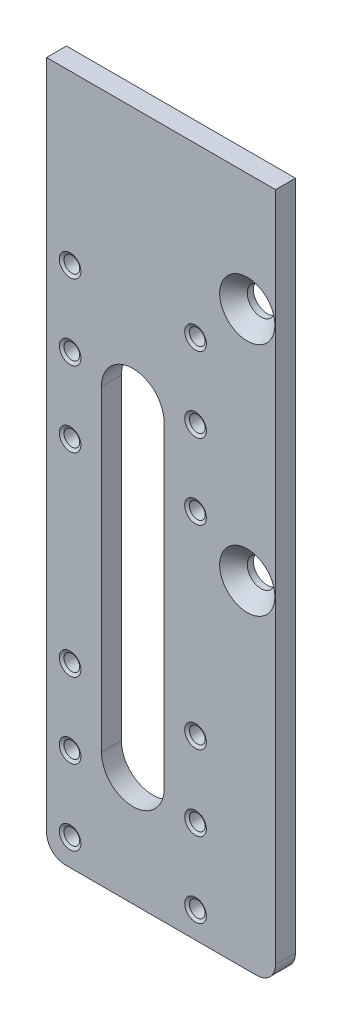
ISO-10303-21;
HEADER;
FILE_DESCRIPTION(('STEP AP214'),'2;1');
FILE_NAME('part.step','',(''),(''),'','','');
FILE_SCHEMA(('AUTOMOTIVE_DESIGN { 1 0 10303 214 1 1 1 1 }'));
ENDSEC;
DATA;
#1=APPLICATION_CONTEXT('core data for automotive mechanical design processes');
#2=APPLICATION_PROTOCOL_DEFINITION('international standard','automotive_design',2000,#1);
#3=PRODUCT_CONTEXT('',#1,'mechanical');
#4=PRODUCT('Part','Part','',(#3));
#5=PRODUCT_RELATED_PRODUCT_CATEGORY('part','',(#4));
#6=PRODUCT_DEFINITION_FORMATION('','',#4);
#7=PRODUCT_DEFINITION_CONTEXT('part definition',#1,'design');
#8=PRODUCT_DEFINITION('design','',#6,#7);
#9=PRODUCT_DEFINITION_SHAPE('','',#8);
#10=(LENGTH_UNIT() NAMED_UNIT(*) SI_UNIT(.MILLI.,.METRE.));
#11=(NAMED_UNIT(*) PLANE_ANGLE_UNIT() SI_UNIT($,.RADIAN.));
#12=(NAMED_UNIT(*) SI_UNIT($,.STERADIAN.) SOLID_ANGLE_UNIT());
#13=UNCERTAINTY_MEASURE_WITH_UNIT(LENGTH_MEASURE(1.E-05),#10,'distance_accuracy_value','');
#14=(GEOMETRIC_REPRESENTATION_CONTEXT(3) GLOBAL_UNCERTAINTY_ASSIGNED_CONTEXT((#13)) GLOBAL_UNIT_ASSIGNED_CONTEXT((#10,
#11,#12)) REPRESENTATION_CONTEXT('',''));
#15=CARTESIAN_POINT('',(0.,0.,0.));
#16=DIRECTION('',(0.,0.,1.));
#17=DIRECTION('',(1.,0.,0.));
#18=AXIS2_PLACEMENT_3D('',#15,#16,#17);
#19=CARTESIAN_POINT('',(-525.816847611489,-465.810072168843,246.750729330188));
#20=DIRECTION('',(0.,0.,1.));
#21=DIRECTION('',(0.,-1.,0.));
#22=AXIS2_PLACEMENT_3D('',#19,#20,#21);
#23=CONICAL_SURFACE('',#22,3.44999999994955,1.04719755119663);
#24=CARTESIAN_POINT('',(-525.816847611489,-465.810072168843,246.750729330242));
#25=DIRECTION('',(0.,0.,1.));
#26=DIRECTION('',(0.,-1.,0.));
#27=AXIS2_PLACEMENT_3D('',#24,#25,#26);
#28=CIRCLE('',#27,3.45000000004347);
#29=CARTESIAN_POINT('',(-525.816847611489,-469.260072168886,246.750729330242));
#30=VERTEX_POINT('',#29);
#31=EDGE_CURVE('E269',#30,#30,#28,.T.);
#32=ORIENTED_EDGE('',*,*,#31,.T.);
#33=EDGE_LOOP('',(#32));
#34=FACE_BOUND('',#33,.T.);
#35=CARTESIAN_POINT('',(-525.816847611489,-465.810072168843,246.202246574448));
#36=DIRECTION('',(0.,0.,1.));
#37=DIRECTION('',(0.,-1.,0.));
#38=AXIS2_PLACEMENT_3D('',#35,#36,#37);
#39=CIRCLE('',#38,2.5);
#40=CARTESIAN_POINT('',(-525.816847611489,-468.310072168843,246.202246574448));
#41=VERTEX_POINT('',#40);
#42=EDGE_CURVE('E178',#41,#41,#39,.F.);
#43=ORIENTED_EDGE('',*,*,#42,.T.);
#44=EDGE_LOOP('',(#43));
#45=FACE_BOUND('',#44,.T.);
#46=ADVANCED_FACE('F17',(#34,#45),#23,.F.);
#47=CARTESIAN_POINT('',(-525.816847611489,-489.810072168843,246.750729330188));
#48=DIRECTION('',(0.,0.,1.));
#49=DIRECTION('',(0.,-1.,0.));
#50=AXIS2_PLACEMENT_3D('',#47,#48,#49);
#51=CONICAL_SURFACE('',#50,3.44999999994955,1.04719755119663);
#52=CARTESIAN_POINT('',(-525.816847611489,-489.810072168843,246.750729330242));
#53=DIRECTION('',(0.,0.,1.));
#54=DIRECTION('',(0.,-1.,0.));
#55=AXIS2_PLACEMENT_3D('',#52,#53,#54);
#56=CIRCLE('',#55,3.45000000004347);
#57=CARTESIAN_POINT('',(-525.816847611489,-493.260072168886,246.750729330242));
#58=VERTEX_POINT('',#57);
#59=EDGE_CURVE('E275',#58,#58,#56,.T.);
#60=ORIENTED_EDGE('',*,*,#59,.T.);
#61=EDGE_LOOP('',(#60));
#62=FACE_BOUND('',#61,.T.);
#63=CARTESIAN_POINT('',(-525.816847611489,-489.810072168843,246.202246574448));
#64=DIRECTION('',(0.,0.,1.));
#65=DIRECTION('',(0.,-1.,0.));
#66=AXIS2_PLACEMENT_3D('',#63,#64,#65);
#67=CIRCLE('',#66,2.5);
#68=CARTESIAN_POINT('',(-525.816847611489,-492.310072168843,246.202246574448));
#69=VERTEX_POINT('',#68);
#70=EDGE_CURVE('E175',#69,#69,#67,.F.);
#71=ORIENTED_EDGE('',*,*,#70,.T.);
#72=EDGE_LOOP('',(#71));
#73=FACE_BOUND('',#72,.T.);
#74=ADVANCED_FACE('F681',(#62,#73),#51,.F.);
#75=CARTESIAN_POINT('',(-525.816847611489,-355.810072168843,246.750729330188));
#76=DIRECTION('',(0.,0.,1.));
#77=DIRECTION('',(0.,-1.,0.));
#78=AXIS2_PLACEMENT_3D('',#75,#76,#77);
#79=CONICAL_SURFACE('',#78,3.44999999994955,1.04719755119663);
#80=CARTESIAN_POINT('',(-525.816847611489,-355.810072168843,246.750729330242));
#81=DIRECTION('',(0.,0.,1.));
#82=DIRECTION('',(0.,-1.,0.));
#83=AXIS2_PLACEMENT_3D('',#80,#81,#82);
#84=CIRCLE('',#83,3.45000000004347);
#85=CARTESIAN_POINT('',(-525.816847611489,-359.260072168886,246.750729330242));
#86=VERTEX_POINT('',#85);
#87=EDGE_CURVE('E98',#86,#86,#84,.T.);
#88=ORIENTED_EDGE('',*,*,#87,.T.);
#89=EDGE_LOOP('',(#88));
#90=FACE_BOUND('',#89,.T.);
#91=CARTESIAN_POINT('',(-525.816847611489,-355.810072168843,246.202246574448));
#92=DIRECTION('',(0.,0.,1.));
#93=DIRECTION('',(0.,-1.,0.));
#94=AXIS2_PLACEMENT_3D('',#91,#92,#93);
#95=CIRCLE('',#94,2.5);
#96=CARTESIAN_POINT('',(-525.816847611489,-358.310072168843,246.202246574448));
#97=VERTEX_POINT('',#96);
#98=EDGE_CURVE('E172',#97,#97,#95,.F.);
#99=ORIENTED_EDGE('',*,*,#98,.T.);
#100=EDGE_LOOP('',(#99));
#101=FACE_BOUND('',#100,.T.);
#102=ADVANCED_FACE('F672',(#90,#101),#79,.F.);
#103=CARTESIAN_POINT('',(-525.816847611489,-379.810072168843,246.750729330188));
#104=DIRECTION('',(0.,0.,1.));
#105=DIRECTION('',(0.,-1.,0.));
#106=AXIS2_PLACEMENT_3D('',#103,#104,#105);
#107=CONICAL_SURFACE('',#106,3.44999999994955,1.04719755119663);
#108=CARTESIAN_POINT('',(-525.816847611489,-379.810072168843,246.750729330242));
#109=DIRECTION('',(0.,0.,1.));
#110=DIRECTION('',(0.,-1.,0.));
#111=AXIS2_PLACEMENT_3D('',#108,#109,#110);
#112=CIRCLE('',#111,3.45000000004347);
#113=CARTESIAN_POINT('',(-525.816847611489,-383.260072168886,246.750729330242));
#114=VERTEX_POINT('',#113);
#115=EDGE_CURVE('E254',#114,#114,#112,.T.);
#116=ORIENTED_EDGE('',*,*,#115,.T.);
#117=EDGE_LOOP('',(#116));
#118=FACE_BOUND('',#117,.T.);
#119=CARTESIAN_POINT('',(-525.816847611489,-379.810072168843,246.202246574448));
#120=DIRECTION('',(0.,0.,1.));
#121=DIRECTION('',(0.,-1.,0.));
#122=AXIS2_PLACEMENT_3D('',#119,#120,#121);
#123=CIRCLE('',#122,2.5);
#124=CARTESIAN_POINT('',(-525.816847611489,-382.310072168843,246.202246574448));
#125=VERTEX_POINT('',#124);
#126=EDGE_CURVE('E169',#125,#125,#123,.F.);
#127=ORIENTED_EDGE('',*,*,#126,.T.);
#128=EDGE_LOOP('',(#127));
#129=FACE_BOUND('',#128,.T.);
#130=ADVANCED_FACE('F663',(#118,#129),#107,.F.);
#131=CARTESIAN_POINT('',(-525.816847611489,-403.810072168843,246.750729330188));
#132=DIRECTION('',(0.,0.,1.));
#133=DIRECTION('',(0.,-1.,0.));
#134=AXIS2_PLACEMENT_3D('',#131,#132,#133);
#135=CONICAL_SURFACE('',#134,3.44999999994955,1.04719755119663);
#136=CARTESIAN_POINT('',(-525.816847611489,-403.810072168843,246.750729330242));
#137=DIRECTION('',(0.,0.,1.));
#138=DIRECTION('',(0.,-1.,0.));
#139=AXIS2_PLACEMENT_3D('',#136,#137,#138);
#140=CIRCLE('',#139,3.45000000004347);
#141=CARTESIAN_POINT('',(-525.816847611489,-407.260072168886,246.750729330242));
#142=VERTEX_POINT('',#141);
#143=EDGE_CURVE('E266',#142,#142,#140,.T.);
#144=ORIENTED_EDGE('',*,*,#143,.T.);
#145=EDGE_LOOP('',(#144));
#146=FACE_BOUND('',#145,.T.);
#147=CARTESIAN_POINT('',(-525.816847611489,-403.810072168843,246.202246574448));
#148=DIRECTION('',(0.,0.,1.));
#149=DIRECTION('',(0.,-1.,0.));
#150=AXIS2_PLACEMENT_3D('',#147,#148,#149);
#151=CIRCLE('',#150,2.5);
#152=CARTESIAN_POINT('',(-525.816847611489,-406.310072168843,246.202246574448));
#153=VERTEX_POINT('',#152);
#154=EDGE_CURVE('E166',#153,#153,#151,.F.);
#155=ORIENTED_EDGE('',*,*,#154,.T.);
#156=EDGE_LOOP('',(#155));
#157=FACE_BOUND('',#156,.T.);
#158=ADVANCED_FACE('F655',(#146,#157),#135,.F.);
#159=CARTESIAN_POINT('',(-565.816847611489,-355.810072168843,246.750729330131));
#160=DIRECTION('',(0.,0.,1.));
#161=DIRECTION('',(1.,0.,0.));
#162=AXIS2_PLACEMENT_3D('',#159,#160,#161);
#163=CONICAL_SURFACE('',#162,3.44999999985629,1.04719755119663);
#164=CARTESIAN_POINT('',(-565.816847611489,-355.810072168843,246.750729330173));
#165=DIRECTION('',(0.,0.,1.));
#166=DIRECTION('',(1.,0.,0.));
#167=AXIS2_PLACEMENT_3D('',#164,#165,#166);
#168=CIRCLE('',#167,3.44999999992979);
#169=CARTESIAN_POINT('',(-562.366847611559,-355.810072168843,246.750729330173));
#170=VERTEX_POINT('',#169);
#171=EDGE_CURVE('E277',#170,#170,#168,.T.);
#172=ORIENTED_EDGE('',*,*,#171,.T.);
#173=EDGE_LOOP('',(#172));
#174=FACE_BOUND('',#173,.T.);
#175=CARTESIAN_POINT('',(-565.816847611489,-355.810072168843,246.202246574448));
#176=DIRECTION('',(0.,0.,1.));
#177=DIRECTION('',(0.,-1.,0.));
#178=AXIS2_PLACEMENT_3D('',#175,#176,#177);
#179=CIRCLE('',#178,2.5);
#180=CARTESIAN_POINT('',(-565.816847611489,-358.310072168843,246.202246574448));
#181=VERTEX_POINT('',#180);
#182=EDGE_CURVE('E163',#181,#181,#179,.F.);
#183=ORIENTED_EDGE('',*,*,#182,.T.);
#184=EDGE_LOOP('',(#183));
#185=FACE_BOUND('',#184,.T.);
#186=ADVANCED_FACE('F646',(#174,#185),#163,.F.);
#187=CARTESIAN_POINT('',(-565.816847611489,-379.810072168843,246.750729330131));
#188=DIRECTION('',(0.,0.,1.));
#189=DIRECTION('',(1.,0.,0.));
#190=AXIS2_PLACEMENT_3D('',#187,#188,#189);
#191=CONICAL_SURFACE('',#190,3.44999999985629,1.04719755119663);
#192=CARTESIAN_POINT('',(-565.816847611489,-379.810072168843,246.750729330173));
#193=DIRECTION('',(0.,0.,1.));
#194=DIRECTION('',(1.,0.,0.));
#195=AXIS2_PLACEMENT_3D('',#192,#193,#194);
#196=CIRCLE('',#195,3.44999999992979);
#197=CARTESIAN_POINT('',(-562.366847611559,-379.810072168843,246.750729330173));
#198=VERTEX_POINT('',#197);
#199=EDGE_CURVE('E260',#198,#198,#196,.T.);
#200=ORIENTED_EDGE('',*,*,#199,.T.);
#201=EDGE_LOOP('',(#200));
#202=FACE_BOUND('',#201,.T.);
#203=CARTESIAN_POINT('',(-565.816847611489,-379.810072168843,246.202246574448));
#204=DIRECTION('',(0.,0.,1.));
#205=DIRECTION('',(0.,-1.,0.));
#206=AXIS2_PLACEMENT_3D('',#203,#204,#205);
#207=CIRCLE('',#206,2.5);
#208=CARTESIAN_POINT('',(-565.816847611489,-382.310072168843,246.202246574448));
#209=VERTEX_POINT('',#208);
#210=EDGE_CURVE('E160',#209,#209,#207,.F.);
#211=ORIENTED_EDGE('',*,*,#210,.T.);
#212=EDGE_LOOP('',(#211));
#213=FACE_BOUND('',#212,.T.);
#214=ADVANCED_FACE('F637',(#202,#213),#191,.F.);
#215=CARTESIAN_POINT('',(-565.816847611489,-403.810072168843,246.750729330131));
#216=DIRECTION('',(0.,0.,1.));
#217=DIRECTION('',(1.,0.,0.));
#218=AXIS2_PLACEMENT_3D('',#215,#216,#217);
#219=CONICAL_SURFACE('',#218,3.44999999985629,1.04719755119663);
#220=CARTESIAN_POINT('',(-565.816847611489,-403.810072168843,246.750729330173));
#221=DIRECTION('',(0.,0.,1.));
#222=DIRECTION('',(1.,0.,0.));
#223=AXIS2_PLACEMENT_3D('',#220,#221,#222);
#224=CIRCLE('',#223,3.44999999992979);
#225=CARTESIAN_POINT('',(-562.366847611559,-403.810072168843,246.750729330173));
#226=VERTEX_POINT('',#225);
#227=EDGE_CURVE('E272',#226,#226,#224,.T.);
#228=ORIENTED_EDGE('',*,*,#227,.T.);
#229=EDGE_LOOP('',(#228));
#230=FACE_BOUND('',#229,.T.);
#231=CARTESIAN_POINT('',(-565.816847611489,-403.810072168843,246.202246574448));
#232=DIRECTION('',(0.,0.,1.));
#233=DIRECTION('',(0.,-1.,0.));
#234=AXIS2_PLACEMENT_3D('',#231,#232,#233);
#235=CIRCLE('',#234,2.5);
#236=CARTESIAN_POINT('',(-565.816847611489,-406.310072168843,246.202246574448));
#237=VERTEX_POINT('',#236);
#238=EDGE_CURVE('E157',#237,#237,#235,.F.);
#239=ORIENTED_EDGE('',*,*,#238,.T.);
#240=EDGE_LOOP('',(#239));
#241=FACE_BOUND('',#240,.T.);
#242=ADVANCED_FACE('F628',(#230,#241),#219,.F.);
#243=CARTESIAN_POINT('',(-509.316847611489,-414.701572168842,246.750729330131));
#244=DIRECTION('',(0.,0.,1.));
#245=DIRECTION('',(1.,0.,0.));
#246=AXIS2_PLACEMENT_3D('',#243,#244,#245);
#247=CONICAL_SURFACE('',#246,8.79999999990633,0.785398163397448);
#248=CARTESIAN_POINT('',(-509.316847611489,-414.701572168842,246.750729330188));
#249=DIRECTION('',(0.,0.,1.));
#250=DIRECTION('',(1.,0.,0.));
#251=AXIS2_PLACEMENT_3D('',#248,#249,#250);
#252=CIRCLE('',#251,8.79999999996317);
#253=CARTESIAN_POINT('',(-500.516847611526,-414.701572168842,246.750729330188));
#254=VERTEX_POINT('',#253);
#255=EDGE_CURVE('E245',#254,#254,#252,.T.);
#256=ORIENTED_EDGE('',*,*,#255,.T.);
#257=EDGE_LOOP('',(#256));
#258=FACE_BOUND('',#257,.T.);
#259=CARTESIAN_POINT('',(-509.316847611489,-414.701572168842,242.350729330178));
#260=DIRECTION('',(0.,0.,1.));
#261=DIRECTION('',(0.,-1.,0.));
#262=AXIS2_PLACEMENT_3D('',#259,#260,#261);
#263=CIRCLE('',#262,4.4);
#264=CARTESIAN_POINT('',(-509.316847611489,-419.101572168842,242.350729330178));
#265=VERTEX_POINT('',#264);
#266=EDGE_CURVE('E154',#265,#265,#263,.F.);
#267=ORIENTED_EDGE('',*,*,#266,.T.);
#268=EDGE_LOOP('',(#267));
#269=FACE_BOUND('',#268,.T.);
#270=ADVANCED_FACE('F620',(#258,#269),#247,.F.);
#271=CARTESIAN_POINT('',(-565.816847611489,-513.810072168843,246.750729330131));
#272=DIRECTION('',(0.,0.,1.));
#273=DIRECTION('',(1.,0.,0.));
#274=AXIS2_PLACEMENT_3D('',#271,#272,#273);
#275=CONICAL_SURFACE('',#274,3.44999999985629,1.04719755119663);
#276=CARTESIAN_POINT('',(-565.816847611489,-513.810072168843,246.750729330173));
#277=DIRECTION('',(0.,0.,1.));
#278=DIRECTION('',(1.,0.,0.));
#279=AXIS2_PLACEMENT_3D('',#276,#277,#278);
#280=CIRCLE('',#279,3.44999999992979);
#281=CARTESIAN_POINT('',(-562.366847611559,-513.810072168843,246.750729330173));
#282=VERTEX_POINT('',#281);
#283=EDGE_CURVE('E20',#282,#282,#280,.T.);
#284=ORIENTED_EDGE('',*,*,#283,.T.);
#285=EDGE_LOOP('',(#284));
#286=FACE_BOUND('',#285,.T.);
#287=CARTESIAN_POINT('',(-565.816847611489,-513.810072168843,246.202246574448));
#288=DIRECTION('',(0.,0.,1.));
#289=DIRECTION('',(0.,-1.,0.));
#290=AXIS2_PLACEMENT_3D('',#287,#288,#289);
#291=CIRCLE('',#290,2.5);
#292=CARTESIAN_POINT('',(-565.816847611489,-516.310072168843,246.202246574448));
#293=VERTEX_POINT('',#292);
#294=EDGE_CURVE('E151',#293,#293,#291,.F.);
#295=ORIENTED_EDGE('',*,*,#294,.T.);
#296=EDGE_LOOP('',(#295));
#297=FACE_BOUND('',#296,.T.);
#298=ADVANCED_FACE('F284',(#286,#297),#275,.F.);
#299=CARTESIAN_POINT('',(-525.816847611489,-513.810072168843,246.750729330188));
#300=DIRECTION('',(0.,0.,1.));
#301=DIRECTION('',(0.,-1.,0.));
#302=AXIS2_PLACEMENT_3D('',#299,#300,#301);
#303=CONICAL_SURFACE('',#302,3.44999999994955,1.04719755119663);
#304=CARTESIAN_POINT('',(-525.816847611489,-513.810072168843,246.750729330242));
#305=DIRECTION('',(0.,0.,1.));
#306=DIRECTION('',(0.,-1.,0.));
#307=AXIS2_PLACEMENT_3D('',#304,#305,#306);
#308=CIRCLE('',#307,3.45000000004347);
#309=CARTESIAN_POINT('',(-525.816847611489,-517.260072168886,246.750729330242));
#310=VERTEX_POINT('',#309);
#311=EDGE_CURVE('E248',#310,#310,#308,.T.);
#312=ORIENTED_EDGE('',*,*,#311,.T.);
#313=EDGE_LOOP('',(#312));
#314=FACE_BOUND('',#313,.T.);
#315=CARTESIAN_POINT('',(-525.816847611489,-513.810072168843,246.202246574448));
#316=DIRECTION('',(0.,0.,1.));
#317=DIRECTION('',(0.,-1.,0.));
#318=AXIS2_PLACEMENT_3D('',#315,#316,#317);
#319=CIRCLE('',#318,2.5);
#320=CARTESIAN_POINT('',(-525.816847611489,-516.310072168843,246.202246574448));
#321=VERTEX_POINT('',#320);
#322=EDGE_CURVE('E148',#321,#321,#319,.F.);
#323=ORIENTED_EDGE('',*,*,#322,.T.);
#324=EDGE_LOOP('',(#323));
#325=FACE_BOUND('',#324,.T.);
#326=ADVANCED_FACE('F603',(#314,#325),#303,.F.);
#327=CARTESIAN_POINT('',(-509.316847611489,-339.701572168842,246.750729330131));
#328=DIRECTION('',(0.,0.,1.));
#329=DIRECTION('',(1.,0.,0.));
#330=AXIS2_PLACEMENT_3D('',#327,#328,#329);
#331=CONICAL_SURFACE('',#330,8.79999999990633,0.785398163397448);
#332=CARTESIAN_POINT('',(-509.316847611489,-339.701572168842,246.750729330188));
#333=DIRECTION('',(0.,0.,1.));
#334=DIRECTION('',(1.,0.,0.));
#335=AXIS2_PLACEMENT_3D('',#332,#333,#334);
#336=CIRCLE('',#335,8.79999999996317);
#337=CARTESIAN_POINT('',(-500.516847611526,-339.701572168842,246.750729330188));
#338=VERTEX_POINT('',#337);
#339=EDGE_CURVE('E251',#338,#338,#336,.T.);
#340=ORIENTED_EDGE('',*,*,#339,.T.);
#341=EDGE_LOOP('',(#340));
#342=FACE_BOUND('',#341,.T.);
#343=CARTESIAN_POINT('',(-509.316847611489,-339.701572168842,242.350729330178));
#344=DIRECTION('',(0.,0.,1.));
#345=DIRECTION('',(0.,-1.,0.));
#346=AXIS2_PLACEMENT_3D('',#343,#344,#345);
#347=CIRCLE('',#346,4.4);
#348=CARTESIAN_POINT('',(-509.316847611489,-344.101572168842,242.350729330178));
#349=VERTEX_POINT('',#348);
#350=EDGE_CURVE('E145',#349,#349,#347,.F.);
#351=ORIENTED_EDGE('',*,*,#350,.T.);
#352=EDGE_LOOP('',(#351));
#353=FACE_BOUND('',#352,.T.);
#354=ADVANCED_FACE('F594',(#342,#353),#331,.F.);
#355=CARTESIAN_POINT('',(-565.816847611489,-489.810072168843,246.750729330131));
#356=DIRECTION('',(0.,0.,1.));
#357=DIRECTION('',(1.,0.,0.));
#358=AXIS2_PLACEMENT_3D('',#355,#356,#357);
#359=CONICAL_SURFACE('',#358,3.44999999985629,1.04719755119663);
#360=CARTESIAN_POINT('',(-565.816847611489,-489.810072168843,246.750729330173));
#361=DIRECTION('',(0.,0.,1.));
#362=DIRECTION('',(1.,0.,0.));
#363=AXIS2_PLACEMENT_3D('',#360,#361,#362);
#364=CIRCLE('',#363,3.44999999992979);
#365=CARTESIAN_POINT('',(-562.366847611559,-489.810072168843,246.750729330173));
#366=VERTEX_POINT('',#365);
#367=EDGE_CURVE('E257',#366,#366,#364,.T.);
#368=ORIENTED_EDGE('',*,*,#367,.T.);
#369=EDGE_LOOP('',(#368));
#370=FACE_BOUND('',#369,.T.);
#371=CARTESIAN_POINT('',(-565.816847611489,-489.810072168843,246.202246574448));
#372=DIRECTION('',(0.,0.,1.));
#373=DIRECTION('',(0.,-1.,0.));
#374=AXIS2_PLACEMENT_3D('',#371,#372,#373);
#375=CIRCLE('',#374,2.5);
#376=CARTESIAN_POINT('',(-565.816847611489,-492.310072168843,246.202246574448));
#377=VERTEX_POINT('',#376);
#378=EDGE_CURVE('E142',#377,#377,#375,.F.);
#379=ORIENTED_EDGE('',*,*,#378,.T.);
#380=EDGE_LOOP('',(#379));
#381=FACE_BOUND('',#380,.T.);
#382=ADVANCED_FACE('F297',(#370,#381),#359,.F.);
#383=CARTESIAN_POINT('',(-565.816847611489,-465.810072168843,246.750729330131));
#384=DIRECTION('',(0.,0.,1.));
#385=DIRECTION('',(1.,0.,0.));
#386=AXIS2_PLACEMENT_3D('',#383,#384,#385);
#387=CONICAL_SURFACE('',#386,3.44999999985629,1.04719755119663);
#388=CARTESIAN_POINT('',(-565.816847611489,-465.810072168843,246.750729330173));
#389=DIRECTION('',(0.,0.,1.));
#390=DIRECTION('',(1.,0.,0.));
#391=AXIS2_PLACEMENT_3D('',#388,#389,#390);
#392=CIRCLE('',#391,3.44999999992979);
#393=CARTESIAN_POINT('',(-562.366847611559,-465.810072168843,246.750729330173));
#394=VERTEX_POINT('',#393);
#395=EDGE_CURVE('E263',#394,#394,#392,.T.);
#396=ORIENTED_EDGE('',*,*,#395,.T.);
#397=EDGE_LOOP('',(#396));
#398=FACE_BOUND('',#397,.T.);
#399=CARTESIAN_POINT('',(-565.816847611489,-465.810072168843,246.202246574448));
#400=DIRECTION('',(0.,0.,1.));
#401=DIRECTION('',(0.,-1.,0.));
#402=AXIS2_PLACEMENT_3D('',#399,#400,#401);
#403=CIRCLE('',#402,2.5);
#404=CARTESIAN_POINT('',(-565.816847611489,-468.310072168843,246.202246574448));
#405=VERTEX_POINT('',#404);
#406=EDGE_CURVE('E126',#405,#405,#403,.F.);
#407=ORIENTED_EDGE('',*,*,#406,.T.);
#408=EDGE_LOOP('',(#407));
#409=FACE_BOUND('',#408,.T.);
#410=ADVANCED_FACE('F288',(#398,#409),#387,.F.);
#411=CARTESIAN_POINT('',(-564.566847611488,-458.810072168843,246.750729330178));
#412=DIRECTION('',(0.,0.,-1.));
#413=DIRECTION('',(0.,1.,0.));
#414=AXIS2_PLACEMENT_3D('',#411,#412,#413);
#415=PLANE('',#414);
#416=DIRECTION('',(-1.,0.,0.));
#417=VECTOR('',#416,1.);
#418=CARTESIAN_POINT('',(-588.489347611488,-302.201572168842,246.750729330178));
#419=LINE('',#418,#417);
#420=CARTESIAN_POINT('',(-573.316847611489,-302.201572168842,246.750729330178));
#421=VERTEX_POINT('',#420);
#422=CARTESIAN_POINT('',(-500.316847611489,-302.201572168842,246.750729330178));
#423=VERTEX_POINT('',#422);
#424=EDGE_CURVE('E127',#421,#423,#419,.F.);
#425=ORIENTED_EDGE('',*,*,#424,.F.);
#426=DIRECTION('',(0.,1.,0.));
#427=VECTOR('',#426,1.);
#428=CARTESIAN_POINT('',(-573.316847611489,-346.310072168843,246.750729330178));
#429=LINE('',#428,#427);
#430=CARTESIAN_POINT('',(-573.316847611489,-516.201572168843,246.750729330178));
#431=VERTEX_POINT('',#430);
#432=EDGE_CURVE('E134',#431,#421,#429,.T.);
#433=ORIENTED_EDGE('',*,*,#432,.F.);
#434=CARTESIAN_POINT('',(-567.316847611489,-516.201572168843,246.750729330178));
#435=DIRECTION('',(0.,0.,1.));
#436=DIRECTION('',(1.,0.,0.));
#437=AXIS2_PLACEMENT_3D('',#434,#435,#436);
#438=CIRCLE('',#437,6.);
#439=CARTESIAN_POINT('',(-567.316847611489,-522.201572168843,246.750729330178));
#440=VERTEX_POINT('',#439);
#441=EDGE_CURVE('E137',#440,#431,#438,.F.);
#442=ORIENTED_EDGE('',*,*,#441,.F.);
#443=DIRECTION('',(-1.,0.,0.));
#444=VECTOR('',#443,1.);
#445=CARTESIAN_POINT('',(-588.489347611488,-522.201572168843,246.750729330178));
#446=LINE('',#445,#444);
#447=CARTESIAN_POINT('',(-506.316847611489,-522.201572168843,246.750729330178));
#448=VERTEX_POINT('',#447);
#449=EDGE_CURVE('E123',#440,#448,#446,.F.);
#450=ORIENTED_EDGE('',*,*,#449,.T.);
#451=CARTESIAN_POINT('',(-506.316847611489,-516.201572168843,246.750729330178));
#452=DIRECTION('',(0.,0.,1.));
#453=DIRECTION('',(1.,0.,0.));
#454=AXIS2_PLACEMENT_3D('',#451,#452,#453);
#455=CIRCLE('',#454,6.);
#456=CARTESIAN_POINT('',(-500.316847611489,-516.201572168843,246.750729330178));
#457=VERTEX_POINT('',#456);
#458=EDGE_CURVE('E236',#457,#448,#455,.F.);
#459=ORIENTED_EDGE('',*,*,#458,.F.);
#460=DIRECTION('',(0.,-1.,0.));
#461=VECTOR('',#460,1.);
#462=CARTESIAN_POINT('',(-500.316847611489,-398.310072168843,246.750729330178));
#463=LINE('',#462,#461);
#464=EDGE_CURVE('E116',#457,#423,#463,.F.);
#465=ORIENTED_EDGE('',*,*,#464,.T.);
#466=EDGE_LOOP('',(#425,#433,#442,#450,#459,#465));
#467=FACE_BOUND('',#466,.T.);
#468=ORIENTED_EDGE('',*,*,#87,.F.);
#469=EDGE_LOOP('',(#468));
#470=FACE_BOUND('',#469,.T.);
#471=ORIENTED_EDGE('',*,*,#255,.F.);
#472=EDGE_LOOP('',(#471));
#473=FACE_BOUND('',#472,.T.);
#474=ORIENTED_EDGE('',*,*,#311,.F.);
#475=EDGE_LOOP('',(#474));
#476=FACE_BOUND('',#475,.T.);
#477=ORIENTED_EDGE('',*,*,#339,.F.);
#478=EDGE_LOOP('',(#477));
#479=FACE_BOUND('',#478,.T.);
#480=ORIENTED_EDGE('',*,*,#115,.F.);
#481=EDGE_LOOP('',(#480));
#482=FACE_BOUND('',#481,.T.);
#483=ORIENTED_EDGE('',*,*,#367,.F.);
#484=EDGE_LOOP('',(#483));
#485=FACE_BOUND('',#484,.T.);
#486=ORIENTED_EDGE('',*,*,#199,.F.);
#487=EDGE_LOOP('',(#486));
#488=FACE_BOUND('',#487,.T.);
#489=ORIENTED_EDGE('',*,*,#395,.F.);
#490=EDGE_LOOP('',(#489));
#491=FACE_BOUND('',#490,.T.);
#492=ORIENTED_EDGE('',*,*,#143,.F.);
#493=EDGE_LOOP('',(#492));
#494=FACE_BOUND('',#493,.T.);
#495=ORIENTED_EDGE('',*,*,#31,.F.);
#496=EDGE_LOOP('',(#495));
#497=FACE_BOUND('',#496,.T.);
#498=ORIENTED_EDGE('',*,*,#227,.F.);
#499=EDGE_LOOP('',(#498));
#500=FACE_BOUND('',#499,.T.);
#501=ORIENTED_EDGE('',*,*,#59,.F.);
#502=EDGE_LOOP('',(#501));
#503=FACE_BOUND('',#502,.T.);
#504=ORIENTED_EDGE('',*,*,#171,.F.);
#505=EDGE_LOOP('',(#504));
#506=FACE_BOUND('',#505,.T.);
#507=ORIENTED_EDGE('',*,*,#283,.F.);
#508=EDGE_LOOP('',(#507));
#509=FACE_BOUND('',#508,.T.);
#510=CARTESIAN_POINT('',(-545.816847611489,-384.310072168843,246.750729330178));
#511=DIRECTION('',(0.,0.,1.));
#512=DIRECTION('',(0.,-1.,0.));
#513=AXIS2_PLACEMENT_3D('',#510,#511,#512);
#514=CIRCLE('',#513,10.);
#515=CARTESIAN_POINT('',(-555.816847611489,-384.310072168843,246.750729330178));
#516=VERTEX_POINT('',#515);
#517=CARTESIAN_POINT('',(-535.816847611489,-384.310072168843,246.750729330178));
#518=VERTEX_POINT('',#517);
#519=EDGE_CURVE('E87',#516,#518,#514,.F.);
#520=ORIENTED_EDGE('',*,*,#519,.T.);
#521=DIRECTION('',(0.,1.,0.));
#522=VECTOR('',#521,1.);
#523=CARTESIAN_POINT('',(-535.816847611489,-398.310072168843,246.750729330178));
#524=LINE('',#523,#522);
#525=CARTESIAN_POINT('',(-535.816847611489,-485.310072168843,246.750729330178));
#526=VERTEX_POINT('',#525);
#527=EDGE_CURVE('E181',#518,#526,#524,.F.);
#528=ORIENTED_EDGE('',*,*,#527,.T.);
#529=CARTESIAN_POINT('',(-545.816847611489,-485.310072168843,246.750729330178));
#530=DIRECTION('',(0.,0.,1.));
#531=DIRECTION('',(0.,-1.,0.));
#532=AXIS2_PLACEMENT_3D('',#529,#530,#531);
#533=CIRCLE('',#532,10.);
#534=CARTESIAN_POINT('',(-555.816847611489,-485.310072168843,246.750729330178));
#535=VERTEX_POINT('',#534);
#536=EDGE_CURVE('E103',#526,#535,#533,.F.);
#537=ORIENTED_EDGE('',*,*,#536,.T.);
#538=DIRECTION('',(0.,1.,0.));
#539=VECTOR('',#538,1.);
#540=CARTESIAN_POINT('',(-555.816847611489,-471.310072168843,246.750729330178));
#541=LINE('',#540,#539);
#542=EDGE_CURVE('E101',#535,#516,#541,.T.);
#543=ORIENTED_EDGE('',*,*,#542,.T.);
#544=EDGE_LOOP('',(#520,#528,#537,#543));
#545=FACE_BOUND('',#544,.T.);
#546=ADVANCED_FACE('F102',(#467,#470,#473,#476,#479,#482,#485,#488,#491,#494,#497,#500,#503,
#506,#509,#545),#415,.F.);
#547=CARTESIAN_POINT('',(-545.816847611489,-384.310072168843,239.765726930178));
#548=DIRECTION('',(0.,0.,1.));
#549=DIRECTION('',(0.,-1.,0.));
#550=AXIS2_PLACEMENT_3D('',#547,#548,#549);
#551=CYLINDRICAL_SURFACE('',#550,10.);
#552=DIRECTION('',(0.,0.,1.));
#553=VECTOR('',#552,1.);
#554=CARTESIAN_POINT('',(-555.816847611489,-384.310072168843,239.765726930178));
#555=LINE('',#554,#553);
#556=CARTESIAN_POINT('',(-555.816847611489,-384.310072168843,240.400729330178));
#557=VERTEX_POINT('',#556);
#558=EDGE_CURVE('E91',#516,#557,#555,.F.);
#559=ORIENTED_EDGE('',*,*,#558,.T.);
#560=CARTESIAN_POINT('',(-545.816847611489,-384.310072168843,240.400729330178));
#561=DIRECTION('',(0.,0.,1.));
#562=DIRECTION('',(0.,-1.,0.));
#563=AXIS2_PLACEMENT_3D('',#560,#561,#562);
#564=CIRCLE('',#563,10.);
#565=CARTESIAN_POINT('',(-535.816847611489,-384.310072168843,240.400729330178));
#566=VERTEX_POINT('',#565);
#567=EDGE_CURVE('E234',#566,#557,#564,.T.);
#568=ORIENTED_EDGE('',*,*,#567,.F.);
#569=DIRECTION('',(0.,0.,-1.));
#570=VECTOR('',#569,1.);
#571=CARTESIAN_POINT('',(-535.816847611489,-384.310072168843,239.765726930178));
#572=LINE('',#571,#570);
#573=EDGE_CURVE('E94',#566,#518,#572,.F.);
#574=ORIENTED_EDGE('',*,*,#573,.T.);
#575=ORIENTED_EDGE('',*,*,#519,.F.);
#576=EDGE_LOOP('',(#559,#568,#574,#575));
#577=FACE_BOUND('',#576,.T.);
#578=ADVANCED_FACE('F89',(#577),#551,.F.);
#579=CARTESIAN_POINT('',(-555.816847611489,-471.310072168843,239.765726930178));
#580=DIRECTION('',(-1.,0.,0.));
#581=DIRECTION('',(0.,0.,1.));
#582=AXIS2_PLACEMENT_3D('',#579,#580,#581);
#583=PLANE('',#582);
#584=DIRECTION('',(0.,0.,1.));
#585=VECTOR('',#584,1.);
#586=CARTESIAN_POINT('',(-555.816847611489,-485.310072168843,239.765726930178));
#587=LINE('',#586,#585);
#588=CARTESIAN_POINT('',(-555.816847611489,-485.310072168843,240.400729330178));
#589=VERTEX_POINT('',#588);
#590=EDGE_CURVE('E106',#535,#589,#587,.F.);
#591=ORIENTED_EDGE('',*,*,#590,.T.);
#592=DIRECTION('',(0.,1.,0.));
#593=VECTOR('',#592,1.);
#594=CARTESIAN_POINT('',(-555.816847611489,-458.810072168843,240.400729330178));
#595=LINE('',#594,#593);
#596=EDGE_CURVE('E110',#557,#589,#595,.F.);
#597=ORIENTED_EDGE('',*,*,#596,.F.);
#598=ORIENTED_EDGE('',*,*,#558,.F.);
#599=ORIENTED_EDGE('',*,*,#542,.F.);
#600=EDGE_LOOP('',(#591,#597,#598,#599));
#601=FACE_BOUND('',#600,.T.);
#602=ADVANCED_FACE('F108',(#601),#583,.F.);
#603=CARTESIAN_POINT('',(-545.816847611489,-485.310072168843,239.765726930178));
#604=DIRECTION('',(0.,0.,1.));
#605=DIRECTION('',(0.,-1.,0.));
#606=AXIS2_PLACEMENT_3D('',#603,#604,#605);
#607=CYLINDRICAL_SURFACE('',#606,10.);
#608=DIRECTION('',(0.,0.,-1.));
#609=VECTOR('',#608,1.);
#610=CARTESIAN_POINT('',(-535.816847611489,-485.310072168843,239.765726930178));
#611=LINE('',#610,#609);
#612=CARTESIAN_POINT('',(-535.816847611489,-485.310072168843,240.400729330178));
#613=VERTEX_POINT('',#612);
#614=EDGE_CURVE('E241',#526,#613,#611,.T.);
#615=ORIENTED_EDGE('',*,*,#614,.T.);
#616=CARTESIAN_POINT('',(-545.816847611489,-485.310072168843,240.400729330178));
#617=DIRECTION('',(0.,0.,1.));
#618=DIRECTION('',(0.,-1.,0.));
#619=AXIS2_PLACEMENT_3D('',#616,#617,#618);
#620=CIRCLE('',#619,10.);
#621=EDGE_CURVE('E231',#589,#613,#620,.T.);
#622=ORIENTED_EDGE('',*,*,#621,.F.);
#623=ORIENTED_EDGE('',*,*,#590,.F.);
#624=ORIENTED_EDGE('',*,*,#536,.F.);
#625=EDGE_LOOP('',(#615,#622,#623,#624));
#626=FACE_BOUND('',#625,.T.);
#627=ADVANCED_FACE('F393',(#626),#607,.F.);
#628=CARTESIAN_POINT('',(-535.816847611489,-398.310072168843,239.765726930178));
#629=DIRECTION('',(1.,0.,0.));
#630=DIRECTION('',(0.,0.,-1.));
#631=AXIS2_PLACEMENT_3D('',#628,#629,#630);
#632=PLANE('',#631);
#633=ORIENTED_EDGE('',*,*,#573,.F.);
#634=DIRECTION('',(0.,1.,0.));
#635=VECTOR('',#634,1.);
#636=CARTESIAN_POINT('',(-535.816847611489,-458.810072168843,240.400729330178));
#637=LINE('',#636,#635);
#638=EDGE_CURVE('E230',#613,#566,#637,.T.);
#639=ORIENTED_EDGE('',*,*,#638,.F.);
#640=ORIENTED_EDGE('',*,*,#614,.F.);
#641=ORIENTED_EDGE('',*,*,#527,.F.);
#642=EDGE_LOOP('',(#633,#639,#640,#641));
#643=FACE_BOUND('',#642,.T.);
#644=ADVANCED_FACE('F389',(#643),#632,.F.);
#645=CARTESIAN_POINT('',(-525.816847611489,-465.810072168843,246.750729330178));
#646=DIRECTION('',(0.,0.,1.));
#647=DIRECTION('',(0.,-1.,0.));
#648=AXIS2_PLACEMENT_3D('',#645,#646,#647);
#649=CYLINDRICAL_SURFACE('',#648,2.5);
#650=ORIENTED_EDGE('',*,*,#42,.F.);
#651=EDGE_LOOP('',(#650));
#652=FACE_BOUND('',#651,.T.);
#653=CARTESIAN_POINT('',(-525.816847611489,-465.810072168843,240.400729330178));
#654=DIRECTION('',(0.,0.,1.));
#655=DIRECTION('',(0.,-1.,0.));
#656=AXIS2_PLACEMENT_3D('',#653,#654,#655);
#657=CIRCLE('',#656,2.5);
#658=CARTESIAN_POINT('',(-525.816847611489,-468.310072168843,240.400729330178));
#659=VERTEX_POINT('',#658);
#660=EDGE_CURVE('E227',#659,#659,#657,.T.);
#661=ORIENTED_EDGE('',*,*,#660,.F.);
#662=EDGE_LOOP('',(#661));
#663=FACE_BOUND('',#662,.T.);
#664=ADVANCED_FACE('F385',(#652,#663),#649,.F.);
#665=CARTESIAN_POINT('',(-525.816847611489,-489.810072168843,246.750729330178));
#666=DIRECTION('',(0.,0.,1.));
#667=DIRECTION('',(0.,-1.,0.));
#668=AXIS2_PLACEMENT_3D('',#665,#666,#667);
#669=CYLINDRICAL_SURFACE('',#668,2.5);
#670=ORIENTED_EDGE('',*,*,#70,.F.);
#671=EDGE_LOOP('',(#670));
#672=FACE_BOUND('',#671,.T.);
#673=CARTESIAN_POINT('',(-525.816847611489,-489.810072168843,240.400729330178));
#674=DIRECTION('',(0.,0.,1.));
#675=DIRECTION('',(0.,-1.,0.));
#676=AXIS2_PLACEMENT_3D('',#673,#674,#675);
#677=CIRCLE('',#676,2.5);
#678=CARTESIAN_POINT('',(-525.816847611489,-492.310072168843,240.400729330178));
#679=VERTEX_POINT('',#678);
#680=EDGE_CURVE('E224',#679,#679,#677,.T.);
#681=ORIENTED_EDGE('',*,*,#680,.F.);
#682=EDGE_LOOP('',(#681));
#683=FACE_BOUND('',#682,.T.);
#684=ADVANCED_FACE('F381',(#672,#683),#669,.F.);
#685=CARTESIAN_POINT('',(-525.816847611489,-355.810072168843,246.750729330178));
#686=DIRECTION('',(0.,0.,1.));
#687=DIRECTION('',(0.,-1.,0.));
#688=AXIS2_PLACEMENT_3D('',#685,#686,#687);
#689=CYLINDRICAL_SURFACE('',#688,2.5);
#690=ORIENTED_EDGE('',*,*,#98,.F.);
#691=EDGE_LOOP('',(#690));
#692=FACE_BOUND('',#691,.T.);
#693=CARTESIAN_POINT('',(-525.816847611489,-355.810072168843,240.400729330178));
#694=DIRECTION('',(0.,0.,1.));
#695=DIRECTION('',(0.,-1.,0.));
#696=AXIS2_PLACEMENT_3D('',#693,#694,#695);
#697=CIRCLE('',#696,2.5);
#698=CARTESIAN_POINT('',(-525.816847611489,-358.310072168843,240.400729330178));
#699=VERTEX_POINT('',#698);
#700=EDGE_CURVE('E221',#699,#699,#697,.T.);
#701=ORIENTED_EDGE('',*,*,#700,.F.);
#702=EDGE_LOOP('',(#701));
#703=FACE_BOUND('',#702,.T.);
#704=ADVANCED_FACE('F377',(#692,#703),#689,.F.);
#705=CARTESIAN_POINT('',(-525.816847611489,-379.810072168843,246.750729330178));
#706=DIRECTION('',(0.,0.,1.));
#707=DIRECTION('',(0.,-1.,0.));
#708=AXIS2_PLACEMENT_3D('',#705,#706,#707);
#709=CYLINDRICAL_SURFACE('',#708,2.5);
#710=ORIENTED_EDGE('',*,*,#126,.F.);
#711=EDGE_LOOP('',(#710));
#712=FACE_BOUND('',#711,.T.);
#713=CARTESIAN_POINT('',(-525.816847611489,-379.810072168843,240.400729330178));
#714=DIRECTION('',(0.,0.,1.));
#715=DIRECTION('',(0.,-1.,0.));
#716=AXIS2_PLACEMENT_3D('',#713,#714,#715);
#717=CIRCLE('',#716,2.5);
#718=CARTESIAN_POINT('',(-525.816847611489,-382.310072168843,240.400729330178));
#719=VERTEX_POINT('',#718);
#720=EDGE_CURVE('E218',#719,#719,#717,.T.);
#721=ORIENTED_EDGE('',*,*,#720,.F.);
#722=EDGE_LOOP('',(#721));
#723=FACE_BOUND('',#722,.T.);
#724=ADVANCED_FACE('F373',(#712,#723),#709,.F.);
#725=CARTESIAN_POINT('',(-525.816847611489,-403.810072168843,246.750729330178));
#726=DIRECTION('',(0.,0.,1.));
#727=DIRECTION('',(0.,-1.,0.));
#728=AXIS2_PLACEMENT_3D('',#725,#726,#727);
#729=CYLINDRICAL_SURFACE('',#728,2.5);
#730=ORIENTED_EDGE('',*,*,#154,.F.);
#731=EDGE_LOOP('',(#730));
#732=FACE_BOUND('',#731,.T.);
#733=CARTESIAN_POINT('',(-525.816847611489,-403.810072168843,240.400729330178));
#734=DIRECTION('',(0.,0.,1.));
#735=DIRECTION('',(0.,-1.,0.));
#736=AXIS2_PLACEMENT_3D('',#733,#734,#735);
#737=CIRCLE('',#736,2.5);
#738=CARTESIAN_POINT('',(-525.816847611489,-406.310072168843,240.400729330178));
#739=VERTEX_POINT('',#738);
#740=EDGE_CURVE('E215',#739,#739,#737,.T.);
#741=ORIENTED_EDGE('',*,*,#740,.F.);
#742=EDGE_LOOP('',(#741));
#743=FACE_BOUND('',#742,.T.);
#744=ADVANCED_FACE('F369',(#732,#743),#729,.F.);
#745=CARTESIAN_POINT('',(-565.816847611489,-355.810072168843,246.750729330178));
#746=DIRECTION('',(0.,0.,1.));
#747=DIRECTION('',(0.,-1.,0.));
#748=AXIS2_PLACEMENT_3D('',#745,#746,#747);
#749=CYLINDRICAL_SURFACE('',#748,2.5);
#750=ORIENTED_EDGE('',*,*,#182,.F.);
#751=EDGE_LOOP('',(#750));
#752=FACE_BOUND('',#751,.T.);
#753=CARTESIAN_POINT('',(-565.816847611489,-355.810072168843,240.400729330178));
#754=DIRECTION('',(0.,0.,1.));
#755=DIRECTION('',(0.,-1.,0.));
#756=AXIS2_PLACEMENT_3D('',#753,#754,#755);
#757=CIRCLE('',#756,2.5);
#758=CARTESIAN_POINT('',(-565.816847611489,-358.310072168843,240.400729330178));
#759=VERTEX_POINT('',#758);
#760=EDGE_CURVE('E212',#759,#759,#757,.T.);
#761=ORIENTED_EDGE('',*,*,#760,.F.);
#762=EDGE_LOOP('',(#761));
#763=FACE_BOUND('',#762,.T.);
#764=ADVANCED_FACE('F365',(#752,#763),#749,.F.);
#765=CARTESIAN_POINT('',(-565.816847611489,-379.810072168843,246.750729330178));
#766=DIRECTION('',(0.,0.,1.));
#767=DIRECTION('',(0.,-1.,0.));
#768=AXIS2_PLACEMENT_3D('',#765,#766,#767);
#769=CYLINDRICAL_SURFACE('',#768,2.5);
#770=ORIENTED_EDGE('',*,*,#210,.F.);
#771=EDGE_LOOP('',(#770));
#772=FACE_BOUND('',#771,.T.);
#773=CARTESIAN_POINT('',(-565.816847611489,-379.810072168843,240.400729330178));
#774=DIRECTION('',(0.,0.,1.));
#775=DIRECTION('',(0.,-1.,0.));
#776=AXIS2_PLACEMENT_3D('',#773,#774,#775);
#777=CIRCLE('',#776,2.5);
#778=CARTESIAN_POINT('',(-565.816847611489,-382.310072168843,240.400729330178));
#779=VERTEX_POINT('',#778);
#780=EDGE_CURVE('E209',#779,#779,#777,.T.);
#781=ORIENTED_EDGE('',*,*,#780,.F.);
#782=EDGE_LOOP('',(#781));
#783=FACE_BOUND('',#782,.T.);
#784=ADVANCED_FACE('F361',(#772,#783),#769,.F.);
#785=CARTESIAN_POINT('',(-565.816847611489,-403.810072168843,246.750729330178));
#786=DIRECTION('',(0.,0.,1.));
#787=DIRECTION('',(0.,-1.,0.));
#788=AXIS2_PLACEMENT_3D('',#785,#786,#787);
#789=CYLINDRICAL_SURFACE('',#788,2.5);
#790=ORIENTED_EDGE('',*,*,#238,.F.);
#791=EDGE_LOOP('',(#790));
#792=FACE_BOUND('',#791,.T.);
#793=CARTESIAN_POINT('',(-565.816847611489,-403.810072168843,240.400729330178));
#794=DIRECTION('',(0.,0.,1.));
#795=DIRECTION('',(0.,-1.,0.));
#796=AXIS2_PLACEMENT_3D('',#793,#794,#795);
#797=CIRCLE('',#796,2.5);
#798=CARTESIAN_POINT('',(-565.816847611489,-406.310072168843,240.400729330178));
#799=VERTEX_POINT('',#798);
#800=EDGE_CURVE('E206',#799,#799,#797,.T.);
#801=ORIENTED_EDGE('',*,*,#800,.F.);
#802=EDGE_LOOP('',(#801));
#803=FACE_BOUND('',#802,.T.);
#804=ADVANCED_FACE('F357',(#792,#803),#789,.F.);
#805=CARTESIAN_POINT('',(-509.316847611489,-414.701572168842,246.750729330178));
#806=DIRECTION('',(0.,0.,1.));
#807=DIRECTION('',(0.,-1.,0.));
#808=AXIS2_PLACEMENT_3D('',#805,#806,#807);
#809=CYLINDRICAL_SURFACE('',#808,4.4);
#810=ORIENTED_EDGE('',*,*,#266,.F.);
#811=EDGE_LOOP('',(#810));
#812=FACE_BOUND('',#811,.T.);
#813=CARTESIAN_POINT('',(-509.316847611489,-414.701572168842,240.400729330178));
#814=DIRECTION('',(0.,0.,1.));
#815=DIRECTION('',(0.,-1.,0.));
#816=AXIS2_PLACEMENT_3D('',#813,#814,#815);
#817=CIRCLE('',#816,4.4);
#818=CARTESIAN_POINT('',(-509.316847611489,-419.101572168842,240.400729330178));
#819=VERTEX_POINT('',#818);
#820=EDGE_CURVE('E203',#819,#819,#817,.T.);
#821=ORIENTED_EDGE('',*,*,#820,.F.);
#822=EDGE_LOOP('',(#821));
#823=FACE_BOUND('',#822,.T.);
#824=ADVANCED_FACE('F353',(#812,#823),#809,.F.);
#825=CARTESIAN_POINT('',(-565.816847611489,-513.810072168843,246.750729330178));
#826=DIRECTION('',(0.,0.,1.));
#827=DIRECTION('',(0.,-1.,0.));
#828=AXIS2_PLACEMENT_3D('',#825,#826,#827);
#829=CYLINDRICAL_SURFACE('',#828,2.5);
#830=ORIENTED_EDGE('',*,*,#294,.F.);
#831=EDGE_LOOP('',(#830));
#832=FACE_BOUND('',#831,.T.);
#833=CARTESIAN_POINT('',(-565.816847611489,-513.810072168843,240.400729330178));
#834=DIRECTION('',(0.,0.,1.));
#835=DIRECTION('',(0.,-1.,0.));
#836=AXIS2_PLACEMENT_3D('',#833,#834,#835);
#837=CIRCLE('',#836,2.5);
#838=CARTESIAN_POINT('',(-565.816847611489,-516.310072168843,240.400729330178));
#839=VERTEX_POINT('',#838);
#840=EDGE_CURVE('E200',#839,#839,#837,.T.);
#841=ORIENTED_EDGE('',*,*,#840,.F.);
#842=EDGE_LOOP('',(#841));
#843=FACE_BOUND('',#842,.T.);
#844=ADVANCED_FACE('F349',(#832,#843),#829,.F.);
#845=CARTESIAN_POINT('',(-525.816847611489,-513.810072168843,246.750729330178));
#846=DIRECTION('',(0.,0.,1.));
#847=DIRECTION('',(0.,-1.,0.));
#848=AXIS2_PLACEMENT_3D('',#845,#846,#847);
#849=CYLINDRICAL_SURFACE('',#848,2.5);
#850=ORIENTED_EDGE('',*,*,#322,.F.);
#851=EDGE_LOOP('',(#850));
#852=FACE_BOUND('',#851,.T.);
#853=CARTESIAN_POINT('',(-525.816847611489,-513.810072168843,240.400729330178));
#854=DIRECTION('',(0.,0.,1.));
#855=DIRECTION('',(0.,-1.,0.));
#856=AXIS2_PLACEMENT_3D('',#853,#854,#855);
#857=CIRCLE('',#856,2.5);
#858=CARTESIAN_POINT('',(-525.816847611489,-516.310072168843,240.400729330178));
#859=VERTEX_POINT('',#858);
#860=EDGE_CURVE('E197',#859,#859,#857,.T.);
#861=ORIENTED_EDGE('',*,*,#860,.F.);
#862=EDGE_LOOP('',(#861));
#863=FACE_BOUND('',#862,.T.);
#864=ADVANCED_FACE('F345',(#852,#863),#849,.F.);
#865=CARTESIAN_POINT('',(-509.316847611489,-339.701572168842,246.750729330178));
#866=DIRECTION('',(0.,0.,1.));
#867=DIRECTION('',(0.,-1.,0.));
#868=AXIS2_PLACEMENT_3D('',#865,#866,#867);
#869=CYLINDRICAL_SURFACE('',#868,4.4);
#870=ORIENTED_EDGE('',*,*,#350,.F.);
#871=EDGE_LOOP('',(#870));
#872=FACE_BOUND('',#871,.T.);
#873=CARTESIAN_POINT('',(-509.316847611489,-339.701572168842,240.400729330178));
#874=DIRECTION('',(0.,0.,1.));
#875=DIRECTION('',(0.,-1.,0.));
#876=AXIS2_PLACEMENT_3D('',#873,#874,#875);
#877=CIRCLE('',#876,4.4);
#878=CARTESIAN_POINT('',(-509.316847611489,-344.101572168842,240.400729330178));
#879=VERTEX_POINT('',#878);
#880=EDGE_CURVE('E194',#879,#879,#877,.T.);
#881=ORIENTED_EDGE('',*,*,#880,.F.);
#882=EDGE_LOOP('',(#881));
#883=FACE_BOUND('',#882,.T.);
#884=ADVANCED_FACE('F341',(#872,#883),#869,.F.);
#885=CARTESIAN_POINT('',(-565.816847611489,-489.810072168843,246.750729330178));
#886=DIRECTION('',(0.,0.,1.));
#887=DIRECTION('',(0.,-1.,0.));
#888=AXIS2_PLACEMENT_3D('',#885,#886,#887);
#889=CYLINDRICAL_SURFACE('',#888,2.5);
#890=ORIENTED_EDGE('',*,*,#378,.F.);
#891=EDGE_LOOP('',(#890));
#892=FACE_BOUND('',#891,.T.);
#893=CARTESIAN_POINT('',(-565.816847611489,-489.810072168843,240.400729330178));
#894=DIRECTION('',(0.,0.,1.));
#895=DIRECTION('',(0.,-1.,0.));
#896=AXIS2_PLACEMENT_3D('',#893,#894,#895);
#897=CIRCLE('',#896,2.5);
#898=CARTESIAN_POINT('',(-565.816847611489,-492.310072168843,240.400729330178));
#899=VERTEX_POINT('',#898);
#900=EDGE_CURVE('E191',#899,#899,#897,.T.);
#901=ORIENTED_EDGE('',*,*,#900,.F.);
#902=EDGE_LOOP('',(#901));
#903=FACE_BOUND('',#902,.T.);
#904=ADVANCED_FACE('F337',(#892,#903),#889,.F.);
#905=CARTESIAN_POINT('',(-565.816847611489,-465.810072168843,246.750729330178));
#906=DIRECTION('',(0.,0.,1.));
#907=DIRECTION('',(0.,-1.,0.));
#908=AXIS2_PLACEMENT_3D('',#905,#906,#907);
#909=CYLINDRICAL_SURFACE('',#908,2.5);
#910=ORIENTED_EDGE('',*,*,#406,.F.);
#911=EDGE_LOOP('',(#910));
#912=FACE_BOUND('',#911,.T.);
#913=CARTESIAN_POINT('',(-565.816847611489,-465.810072168843,240.400729330178));
#914=DIRECTION('',(0.,0.,1.));
#915=DIRECTION('',(0.,-1.,0.));
#916=AXIS2_PLACEMENT_3D('',#913,#914,#915);
#917=CIRCLE('',#916,2.5);
#918=CARTESIAN_POINT('',(-565.816847611489,-468.310072168843,240.400729330178));
#919=VERTEX_POINT('',#918);
#920=EDGE_CURVE('E188',#919,#919,#917,.T.);
#921=ORIENTED_EDGE('',*,*,#920,.F.);
#922=EDGE_LOOP('',(#921));
#923=FACE_BOUND('',#922,.T.);
#924=ADVANCED_FACE('F333',(#912,#923),#909,.F.);
#925=CARTESIAN_POINT('',(-588.489347611488,-522.201572168843,345.950729330178));
#926=DIRECTION('',(0.,1.,0.));
#927=DIRECTION('',(-1.,0.,0.));
#928=AXIS2_PLACEMENT_3D('',#925,#926,#927);
#929=PLANE('',#928);
#930=ORIENTED_EDGE('',*,*,#449,.F.);
#931=DIRECTION('',(0.,0.,1.));
#932=VECTOR('',#931,1.);
#933=CARTESIAN_POINT('',(-567.316847611489,-522.201572168843,246.750729330178));
#934=LINE('',#933,#932);
#935=CARTESIAN_POINT('',(-567.316847611489,-522.201572168843,240.400729330178));
#936=VERTEX_POINT('',#935);
#937=EDGE_CURVE('E125',#936,#440,#934,.T.);
#938=ORIENTED_EDGE('',*,*,#937,.F.);
#939=DIRECTION('',(1.,0.,0.));
#940=VECTOR('',#939,1.);
#941=CARTESIAN_POINT('',(-564.566847611488,-522.201572168843,240.400729330178));
#942=LINE('',#941,#940);
#943=CARTESIAN_POINT('',(-506.316847611489,-522.201572168843,240.400729330178));
#944=VERTEX_POINT('',#943);
#945=EDGE_CURVE('E187',#944,#936,#942,.F.);
#946=ORIENTED_EDGE('',*,*,#945,.F.);
#947=DIRECTION('',(0.,0.,1.));
#948=VECTOR('',#947,1.);
#949=CARTESIAN_POINT('',(-506.316847611489,-522.201572168843,246.750729330178));
#950=LINE('',#949,#948);
#951=EDGE_CURVE('E119',#448,#944,#950,.F.);
#952=ORIENTED_EDGE('',*,*,#951,.F.);
#953=EDGE_LOOP('',(#930,#938,#946,#952));
#954=FACE_BOUND('',#953,.T.);
#955=ADVANCED_FACE('F329',(#954),#929,.F.);
#956=CARTESIAN_POINT('',(-567.316847611489,-516.201572168843,246.750729330178));
#957=DIRECTION('',(0.,0.,1.));
#958=DIRECTION('',(1.,0.,0.));
#959=AXIS2_PLACEMENT_3D('',#956,#957,#958);
#960=CYLINDRICAL_SURFACE('',#959,6.);
#961=DIRECTION('',(0.,0.,1.));
#962=VECTOR('',#961,1.);
#963=CARTESIAN_POINT('',(-573.316847611489,-516.201572168843,246.750729330178));
#964=LINE('',#963,#962);
#965=CARTESIAN_POINT('',(-573.316847611489,-516.201572168843,240.400729330178));
#966=VERTEX_POINT('',#965);
#967=EDGE_CURVE('E131',#966,#431,#964,.T.);
#968=ORIENTED_EDGE('',*,*,#967,.F.);
#969=CARTESIAN_POINT('',(-567.316847611489,-516.201572168843,240.400729330178));
#970=DIRECTION('',(0.,0.,1.));
#971=DIRECTION('',(1.,0.,0.));
#972=AXIS2_PLACEMENT_3D('',#969,#970,#971);
#973=CIRCLE('',#972,6.);
#974=EDGE_CURVE('E183',#936,#966,#973,.F.);
#975=ORIENTED_EDGE('',*,*,#974,.F.);
#976=ORIENTED_EDGE('',*,*,#937,.T.);
#977=ORIENTED_EDGE('',*,*,#441,.T.);
#978=EDGE_LOOP('',(#968,#975,#976,#977));
#979=FACE_BOUND('',#978,.T.);
#980=ADVANCED_FACE('F325',(#979),#960,.T.);
#981=CARTESIAN_POINT('',(-573.316847611489,-346.310072168843,246.750729330178));
#982=DIRECTION('',(-1.,0.,0.));
#983=DIRECTION('',(0.,0.,1.));
#984=AXIS2_PLACEMENT_3D('',#981,#982,#983);
#985=PLANE('',#984);
#986=DIRECTION('',(0.,1.,0.));
#987=VECTOR('',#986,1.);
#988=CARTESIAN_POINT('',(-573.316847611489,-458.810072168843,240.400729330178));
#989=LINE('',#988,#987);
#990=CARTESIAN_POINT('',(-573.316847611489,-302.201572168842,240.400729330178));
#991=VERTEX_POINT('',#990);
#992=EDGE_CURVE('E186',#966,#991,#989,.T.);
#993=ORIENTED_EDGE('',*,*,#992,.F.);
#994=ORIENTED_EDGE('',*,*,#967,.T.);
#995=ORIENTED_EDGE('',*,*,#432,.T.);
#996=DIRECTION('',(0.,0.,1.));
#997=VECTOR('',#996,1.);
#998=CARTESIAN_POINT('',(-573.316847611489,-302.201572168842,345.950729330178));
#999=LINE('',#998,#997);
#1000=EDGE_CURVE('E130',#991,#421,#999,.T.);
#1001=ORIENTED_EDGE('',*,*,#1000,.F.);
#1002=EDGE_LOOP('',(#993,#994,#995,#1001));
#1003=FACE_BOUND('',#1002,.T.);
#1004=ADVANCED_FACE('F321',(#1003),#985,.T.);
#1005=CARTESIAN_POINT('',(-588.489347611488,-302.201572168842,345.950729330178));
#1006=DIRECTION('',(0.,1.,0.));
#1007=DIRECTION('',(-1.,0.,0.));
#1008=AXIS2_PLACEMENT_3D('',#1005,#1006,#1007);
#1009=PLANE('',#1008);
#1010=DIRECTION('',(1.,0.,0.));
#1011=VECTOR('',#1010,1.);
#1012=CARTESIAN_POINT('',(-564.566847611488,-302.201572168842,240.400729330178));
#1013=LINE('',#1012,#1011);
#1014=CARTESIAN_POINT('',(-500.316847611489,-302.201572168842,240.400729330178));
#1015=VERTEX_POINT('',#1014);
#1016=EDGE_CURVE('E735',#991,#1015,#1013,.T.);
#1017=ORIENTED_EDGE('',*,*,#1016,.F.);
#1018=ORIENTED_EDGE('',*,*,#1000,.T.);
#1019=ORIENTED_EDGE('',*,*,#424,.T.);
#1020=DIRECTION('',(0.,0.,1.));
#1021=VECTOR('',#1020,1.);
#1022=CARTESIAN_POINT('',(-500.316847611489,-302.201572168842,231.400729330178));
#1023=LINE('',#1022,#1021);
#1024=EDGE_CURVE('E120',#423,#1015,#1023,.F.);
#1025=ORIENTED_EDGE('',*,*,#1024,.T.);
#1026=EDGE_LOOP('',(#1017,#1018,#1019,#1025));
#1027=FACE_BOUND('',#1026,.T.);
#1028=ADVANCED_FACE('F318',(#1027),#1009,.T.);
#1029=CARTESIAN_POINT('',(-500.316847611489,-398.310072168843,231.400729330178));
#1030=DIRECTION('',(-1.,0.,0.));
#1031=DIRECTION('',(0.,-1.,0.));
#1032=AXIS2_PLACEMENT_3D('',#1029,#1030,#1031);
#1033=PLANE('',#1032);
#1034=DIRECTION('',(0.,0.,1.));
#1035=VECTOR('',#1034,1.);
#1036=CARTESIAN_POINT('',(-500.316847611489,-516.201572168843,246.750729330178));
#1037=LINE('',#1036,#1035);
#1038=CARTESIAN_POINT('',(-500.316847611489,-516.201572168843,240.400729330178));
#1039=VERTEX_POINT('',#1038);
#1040=EDGE_CURVE('E35',#1039,#457,#1037,.T.);
#1041=ORIENTED_EDGE('',*,*,#1040,.F.);
#1042=DIRECTION('',(0.,1.,0.));
#1043=VECTOR('',#1042,1.);
#1044=CARTESIAN_POINT('',(-500.316847611489,-458.810072168843,240.400729330178));
#1045=LINE('',#1044,#1043);
#1046=EDGE_CURVE('E26',#1015,#1039,#1045,.F.);
#1047=ORIENTED_EDGE('',*,*,#1046,.F.);
#1048=ORIENTED_EDGE('',*,*,#1024,.F.);
#1049=ORIENTED_EDGE('',*,*,#464,.F.);
#1050=EDGE_LOOP('',(#1041,#1047,#1048,#1049));
#1051=FACE_BOUND('',#1050,.T.);
#1052=ADVANCED_FACE('F310',(#1051),#1033,.F.);
#1053=CARTESIAN_POINT('',(-506.316847611489,-516.201572168843,246.750729330178));
#1054=DIRECTION('',(0.,0.,1.));
#1055=DIRECTION('',(1.,0.,0.));
#1056=AXIS2_PLACEMENT_3D('',#1053,#1054,#1055);
#1057=CYLINDRICAL_SURFACE('',#1056,6.);
#1058=ORIENTED_EDGE('',*,*,#1040,.T.);
#1059=ORIENTED_EDGE('',*,*,#458,.T.);
#1060=ORIENTED_EDGE('',*,*,#951,.T.);
#1061=CARTESIAN_POINT('',(-506.316847611489,-516.201572168843,240.400729330178));
#1062=DIRECTION('',(0.,0.,1.));
#1063=DIRECTION('',(1.,0.,0.));
#1064=AXIS2_PLACEMENT_3D('',#1061,#1062,#1063);
#1065=CIRCLE('',#1064,6.);
#1066=EDGE_CURVE('E11',#1039,#944,#1065,.F.);
#1067=ORIENTED_EDGE('',*,*,#1066,.F.);
#1068=EDGE_LOOP('',(#1058,#1059,#1060,#1067));
#1069=FACE_BOUND('',#1068,.T.);
#1070=ADVANCED_FACE('F304',(#1069),#1057,.T.);
#1071=CARTESIAN_POINT('',(-564.566847611488,-458.810072168843,240.400729330178));
#1072=DIRECTION('',(0.,0.,-1.));
#1073=DIRECTION('',(0.,1.,0.));
#1074=AXIS2_PLACEMENT_3D('',#1071,#1072,#1073);
#1075=PLANE('',#1074);
#1076=ORIENTED_EDGE('',*,*,#1046,.T.);
#1077=ORIENTED_EDGE('',*,*,#1066,.T.);
#1078=ORIENTED_EDGE('',*,*,#945,.T.);
#1079=ORIENTED_EDGE('',*,*,#974,.T.);
#1080=ORIENTED_EDGE('',*,*,#992,.T.);
#1081=ORIENTED_EDGE('',*,*,#1016,.T.);
#1082=EDGE_LOOP('',(#1076,#1077,#1078,#1079,#1080,#1081));
#1083=FACE_BOUND('',#1082,.T.);
#1084=ORIENTED_EDGE('',*,*,#920,.T.);
#1085=EDGE_LOOP('',(#1084));
#1086=FACE_BOUND('',#1085,.T.);
#1087=ORIENTED_EDGE('',*,*,#900,.T.);
#1088=EDGE_LOOP('',(#1087));
#1089=FACE_BOUND('',#1088,.T.);
#1090=ORIENTED_EDGE('',*,*,#880,.T.);
#1091=EDGE_LOOP('',(#1090));
#1092=FACE_BOUND('',#1091,.T.);
#1093=ORIENTED_EDGE('',*,*,#860,.T.);
#1094=EDGE_LOOP('',(#1093));
#1095=FACE_BOUND('',#1094,.T.);
#1096=ORIENTED_EDGE('',*,*,#840,.T.);
#1097=EDGE_LOOP('',(#1096));
#1098=FACE_BOUND('',#1097,.T.);
#1099=ORIENTED_EDGE('',*,*,#820,.T.);
#1100=EDGE_LOOP('',(#1099));
#1101=FACE_BOUND('',#1100,.T.);
#1102=ORIENTED_EDGE('',*,*,#800,.T.);
#1103=EDGE_LOOP('',(#1102));
#1104=FACE_BOUND('',#1103,.T.);
#1105=ORIENTED_EDGE('',*,*,#780,.T.);
#1106=EDGE_LOOP('',(#1105));
#1107=FACE_BOUND('',#1106,.T.);
#1108=ORIENTED_EDGE('',*,*,#760,.T.);
#1109=EDGE_LOOP('',(#1108));
#1110=FACE_BOUND('',#1109,.T.);
#1111=ORIENTED_EDGE('',*,*,#740,.T.);
#1112=EDGE_LOOP('',(#1111));
#1113=FACE_BOUND('',#1112,.T.);
#1114=ORIENTED_EDGE('',*,*,#720,.T.);
#1115=EDGE_LOOP('',(#1114));
#1116=FACE_BOUND('',#1115,.T.);
#1117=ORIENTED_EDGE('',*,*,#700,.T.);
#1118=EDGE_LOOP('',(#1117));
#1119=FACE_BOUND('',#1118,.T.);
#1120=ORIENTED_EDGE('',*,*,#680,.T.);
#1121=EDGE_LOOP('',(#1120));
#1122=FACE_BOUND('',#1121,.T.);
#1123=ORIENTED_EDGE('',*,*,#660,.T.);
#1124=EDGE_LOOP('',(#1123));
#1125=FACE_BOUND('',#1124,.T.);
#1126=ORIENTED_EDGE('',*,*,#621,.T.);
#1127=ORIENTED_EDGE('',*,*,#638,.T.);
#1128=ORIENTED_EDGE('',*,*,#567,.T.);
#1129=ORIENTED_EDGE('',*,*,#596,.T.);
#1130=EDGE_LOOP('',(#1126,#1127,#1128,#1129));
#1131=FACE_BOUND('',#1130,.T.);
#1132=ADVANCED_FACE('F302',(#1083,#1086,#1089,#1092,#1095,#1098,#1101,#1104,#1107,#1110,#1113,
#1116,#1119,#1122,#1125,#1131),#1075,.T.);
#1133=CLOSED_SHELL('',(#46,#74,#102,#130,#158,#186,#214,#242,#270,#298,#326,#354,#382,#410,#546,
#578,#602,#627,#644,#664,#684,#704,#724,#744,#764,#784,#804,#824,#844,#864,#884,#904,#924,#955,
#980,#1004,#1028,#1052,#1070,#1132));
#1134=MANIFOLD_SOLID_BREP('B1',#1133);
#1135=ADVANCED_BREP_SHAPE_REPRESENTATION('',(#18,#1134),#14);
#1136=SHAPE_DEFINITION_REPRESENTATION(#9,#1135);
ENDSEC;
END-ISO-10303-21;
